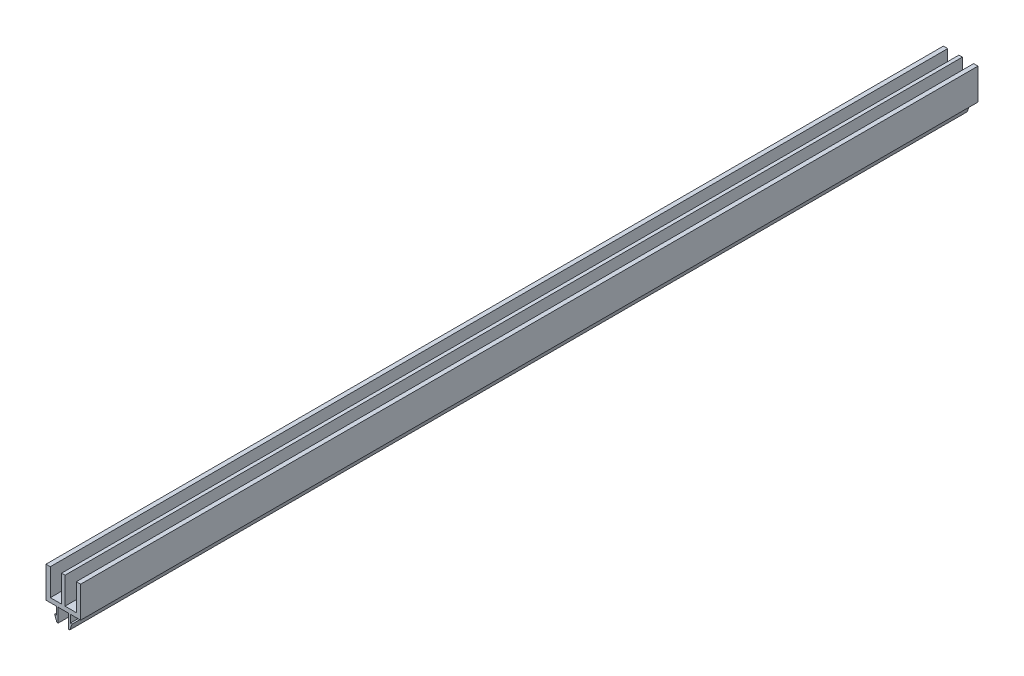
ISO-10303-21;
HEADER;
FILE_DESCRIPTION(('STEP AP214'),'2;1');
FILE_NAME('part.step','',(''),(''),'','','');
FILE_SCHEMA(('AUTOMOTIVE_DESIGN { 1 0 10303 214 1 1 1 1 }'));
ENDSEC;
DATA;
#1=APPLICATION_CONTEXT('core data for automotive mechanical design processes');
#2=APPLICATION_PROTOCOL_DEFINITION('international standard','automotive_design',2000,#1);
#3=PRODUCT_CONTEXT('',#1,'mechanical');
#4=PRODUCT('Part','Part','',(#3));
#5=PRODUCT_RELATED_PRODUCT_CATEGORY('part','',(#4));
#6=PRODUCT_DEFINITION_FORMATION('','',#4);
#7=PRODUCT_DEFINITION_CONTEXT('part definition',#1,'design');
#8=PRODUCT_DEFINITION('design','',#6,#7);
#9=PRODUCT_DEFINITION_SHAPE('','',#8);
#10=(LENGTH_UNIT() NAMED_UNIT(*) SI_UNIT(.MILLI.,.METRE.));
#11=(NAMED_UNIT(*) PLANE_ANGLE_UNIT() SI_UNIT($,.RADIAN.));
#12=(NAMED_UNIT(*) SI_UNIT($,.STERADIAN.) SOLID_ANGLE_UNIT());
#13=UNCERTAINTY_MEASURE_WITH_UNIT(LENGTH_MEASURE(1.E-05),#10,'distance_accuracy_value','');
#14=(GEOMETRIC_REPRESENTATION_CONTEXT(3) GLOBAL_UNCERTAINTY_ASSIGNED_CONTEXT((#13)) GLOBAL_UNIT_ASSIGNED_CONTEXT((#10,
#11,#12)) REPRESENTATION_CONTEXT('',''));
#15=CARTESIAN_POINT('',(0.,0.,0.));
#16=DIRECTION('',(0.,0.,1.));
#17=DIRECTION('',(1.,0.,0.));
#18=AXIS2_PLACEMENT_3D('',#15,#16,#17);
#19=CARTESIAN_POINT('',(-1.,17.9999999975,-468.));
#20=DIRECTION('',(-1.,0.,0.));
#21=DIRECTION('',(0.,-1.,0.));
#22=AXIS2_PLACEMENT_3D('',#19,#20,#21);
#23=PLANE('',#22);
#24=DIRECTION('',(0.,-1.,0.));
#25=VECTOR('',#24,1.);
#26=CARTESIAN_POINT('',(-1.,17.9999999975,50.));
#27=LINE('',#26,#25);
#28=CARTESIAN_POINT('',(-1.,17.9999999975,50.));
#29=VERTEX_POINT('',#28);
#30=CARTESIAN_POINT('',(-1.,2.4999999995,50.));
#31=VERTEX_POINT('',#30);
#32=EDGE_CURVE('E226',#29,#31,#27,.T.);
#33=ORIENTED_EDGE('',*,*,#32,.F.);
#34=DIRECTION('',(0.,0.,1.));
#35=VECTOR('',#34,1.);
#36=CARTESIAN_POINT('',(-1.,17.9999999975,-468.));
#37=LINE('',#36,#35);
#38=CARTESIAN_POINT('',(-1.,17.9999999975,-468.));
#39=VERTEX_POINT('',#38);
#40=EDGE_CURVE('E11',#39,#29,#37,.T.);
#41=ORIENTED_EDGE('',*,*,#40,.F.);
#42=DIRECTION('',(0.,-1.,0.));
#43=VECTOR('',#42,1.);
#44=CARTESIAN_POINT('',(-1.,17.9999999975,-468.));
#45=LINE('',#44,#43);
#46=CARTESIAN_POINT('',(-1.,2.4999999995,-468.));
#47=VERTEX_POINT('',#46);
#48=EDGE_CURVE('E294',#39,#47,#45,.T.);
#49=ORIENTED_EDGE('',*,*,#48,.T.);
#50=DIRECTION('',(0.,0.,1.));
#51=VECTOR('',#50,1.);
#52=CARTESIAN_POINT('',(-1.,2.4999999995,-468.));
#53=LINE('',#52,#51);
#54=EDGE_CURVE('E36',#47,#31,#53,.T.);
#55=ORIENTED_EDGE('',*,*,#54,.T.);
#56=EDGE_LOOP('',(#33,#41,#49,#55));
#57=FACE_BOUND('',#56,.T.);
#58=ADVANCED_FACE('F33',(#57),#23,.T.);
#59=CARTESIAN_POINT('',(0.999999999999998,17.9999999975,-468.));
#60=DIRECTION('',(0.,1.,0.));
#61=DIRECTION('',(0.,0.,1.));
#62=AXIS2_PLACEMENT_3D('',#59,#60,#61);
#63=PLANE('',#62);
#64=DIRECTION('',(-1.,0.,0.));
#65=VECTOR('',#64,1.);
#66=CARTESIAN_POINT('',(0.999999999999998,17.9999999975,50.));
#67=LINE('',#66,#65);
#68=CARTESIAN_POINT('',(0.999999999999998,17.9999999975,50.));
#69=VERTEX_POINT('',#68);
#70=EDGE_CURVE('E292',#69,#29,#67,.T.);
#71=ORIENTED_EDGE('',*,*,#70,.F.);
#72=DIRECTION('',(0.,0.,1.));
#73=VECTOR('',#72,1.);
#74=CARTESIAN_POINT('',(0.999999999999998,17.9999999975,-468.));
#75=LINE('',#74,#73);
#76=CARTESIAN_POINT('',(0.999999999999998,17.9999999975,-468.));
#77=VERTEX_POINT('',#76);
#78=EDGE_CURVE('E42',#77,#69,#75,.T.);
#79=ORIENTED_EDGE('',*,*,#78,.F.);
#80=DIRECTION('',(-1.,0.,0.));
#81=VECTOR('',#80,1.);
#82=CARTESIAN_POINT('',(0.999999999999998,17.9999999975,-468.));
#83=LINE('',#82,#81);
#84=EDGE_CURVE('E216',#77,#39,#83,.T.);
#85=ORIENTED_EDGE('',*,*,#84,.T.);
#86=ORIENTED_EDGE('',*,*,#40,.T.);
#87=EDGE_LOOP('',(#71,#79,#85,#86));
#88=FACE_BOUND('',#87,.T.);
#89=ADVANCED_FACE('F338',(#88),#63,.T.);
#90=CARTESIAN_POINT('',(0.999999999999998,2.4999999995,-468.));
#91=DIRECTION('',(1.,0.,0.));
#92=DIRECTION('',(0.,0.,-1.));
#93=AXIS2_PLACEMENT_3D('',#90,#91,#92);
#94=PLANE('',#93);
#95=DIRECTION('',(0.,1.,0.));
#96=VECTOR('',#95,1.);
#97=CARTESIAN_POINT('',(0.999999999999998,2.4999999995,50.));
#98=LINE('',#97,#96);
#99=CARTESIAN_POINT('',(0.999999999999998,2.4999999995,50.));
#100=VERTEX_POINT('',#99);
#101=EDGE_CURVE('E203',#100,#69,#98,.T.);
#102=ORIENTED_EDGE('',*,*,#101,.F.);
#103=DIRECTION('',(0.,0.,1.));
#104=VECTOR('',#103,1.);
#105=CARTESIAN_POINT('',(0.999999999999998,2.4999999995,-468.));
#106=LINE('',#105,#104);
#107=CARTESIAN_POINT('',(0.999999999999998,2.4999999995,-468.));
#108=VERTEX_POINT('',#107);
#109=EDGE_CURVE('E198',#108,#100,#106,.T.);
#110=ORIENTED_EDGE('',*,*,#109,.F.);
#111=DIRECTION('',(0.,1.,0.));
#112=VECTOR('',#111,1.);
#113=CARTESIAN_POINT('',(0.999999999999998,2.4999999995,-468.));
#114=LINE('',#113,#112);
#115=EDGE_CURVE('E201',#108,#77,#114,.T.);
#116=ORIENTED_EDGE('',*,*,#115,.T.);
#117=ORIENTED_EDGE('',*,*,#78,.T.);
#118=EDGE_LOOP('',(#102,#110,#116,#117));
#119=FACE_BOUND('',#118,.T.);
#120=ADVANCED_FACE('F200',(#119),#94,.T.);
#121=CARTESIAN_POINT('',(7.5,2.4999999995,-468.));
#122=DIRECTION('',(0.,1.,0.));
#123=DIRECTION('',(-1.,0.,0.));
#124=AXIS2_PLACEMENT_3D('',#121,#122,#123);
#125=PLANE('',#124);
#126=DIRECTION('',(-1.,0.,0.));
#127=VECTOR('',#126,1.);
#128=CARTESIAN_POINT('',(7.5,2.4999999995,50.));
#129=LINE('',#128,#127);
#130=CARTESIAN_POINT('',(7.5,2.4999999995,50.));
#131=VERTEX_POINT('',#130);
#132=EDGE_CURVE('E289',#131,#100,#129,.T.);
#133=ORIENTED_EDGE('',*,*,#132,.F.);
#134=DIRECTION('',(0.,0.,1.));
#135=VECTOR('',#134,1.);
#136=CARTESIAN_POINT('',(7.5,2.4999999995,-468.));
#137=LINE('',#136,#135);
#138=CARTESIAN_POINT('',(7.5,2.4999999995,-468.));
#139=VERTEX_POINT('',#138);
#140=EDGE_CURVE('E208',#139,#131,#137,.T.);
#141=ORIENTED_EDGE('',*,*,#140,.F.);
#142=DIRECTION('',(-1.,0.,0.));
#143=VECTOR('',#142,1.);
#144=CARTESIAN_POINT('',(7.5,2.4999999995,-468.));
#145=LINE('',#144,#143);
#146=EDGE_CURVE('E214',#139,#108,#145,.T.);
#147=ORIENTED_EDGE('',*,*,#146,.T.);
#148=ORIENTED_EDGE('',*,*,#109,.T.);
#149=EDGE_LOOP('',(#133,#141,#147,#148));
#150=FACE_BOUND('',#149,.T.);
#151=ADVANCED_FACE('F218',(#150),#125,.T.);
#152=CARTESIAN_POINT('',(7.5,17.9999999975,-468.));
#153=DIRECTION('',(-1.,0.,0.));
#154=DIRECTION('',(0.,-1.,0.));
#155=AXIS2_PLACEMENT_3D('',#152,#153,#154);
#156=PLANE('',#155);
#157=DIRECTION('',(0.,-1.,0.));
#158=VECTOR('',#157,1.);
#159=CARTESIAN_POINT('',(7.5,17.9999999975,50.));
#160=LINE('',#159,#158);
#161=CARTESIAN_POINT('',(7.5,17.9999999975,50.));
#162=VERTEX_POINT('',#161);
#163=EDGE_CURVE('E286',#162,#131,#160,.T.);
#164=ORIENTED_EDGE('',*,*,#163,.F.);
#165=DIRECTION('',(0.,0.,1.));
#166=VECTOR('',#165,1.);
#167=CARTESIAN_POINT('',(7.5,17.9999999975,-468.));
#168=LINE('',#167,#166);
#169=CARTESIAN_POINT('',(7.5,17.9999999975,-468.));
#170=VERTEX_POINT('',#169);
#171=EDGE_CURVE('E298',#170,#162,#168,.T.);
#172=ORIENTED_EDGE('',*,*,#171,.F.);
#173=DIRECTION('',(0.,-1.,0.));
#174=VECTOR('',#173,1.);
#175=CARTESIAN_POINT('',(7.5,17.9999999975,-468.));
#176=LINE('',#175,#174);
#177=EDGE_CURVE('E219',#170,#139,#176,.T.);
#178=ORIENTED_EDGE('',*,*,#177,.T.);
#179=ORIENTED_EDGE('',*,*,#140,.T.);
#180=EDGE_LOOP('',(#164,#172,#178,#179));
#181=FACE_BOUND('',#180,.T.);
#182=ADVANCED_FACE('F351',(#181),#156,.T.);
#183=CARTESIAN_POINT('',(10.,17.9999999975,-468.));
#184=DIRECTION('',(0.,1.,0.));
#185=DIRECTION('',(0.,0.,1.));
#186=AXIS2_PLACEMENT_3D('',#183,#184,#185);
#187=PLANE('',#186);
#188=DIRECTION('',(-1.,0.,0.));
#189=VECTOR('',#188,1.);
#190=CARTESIAN_POINT('',(10.,17.9999999975,50.));
#191=LINE('',#190,#189);
#192=CARTESIAN_POINT('',(10.,17.9999999975,50.));
#193=VERTEX_POINT('',#192);
#194=EDGE_CURVE('E283',#193,#162,#191,.T.);
#195=ORIENTED_EDGE('',*,*,#194,.F.);
#196=DIRECTION('',(0.,0.,1.));
#197=VECTOR('',#196,1.);
#198=CARTESIAN_POINT('',(10.,17.9999999975,-468.));
#199=LINE('',#198,#197);
#200=CARTESIAN_POINT('',(10.,17.9999999975,-468.));
#201=VERTEX_POINT('',#200);
#202=EDGE_CURVE('E300',#201,#193,#199,.T.);
#203=ORIENTED_EDGE('',*,*,#202,.F.);
#204=DIRECTION('',(-1.,0.,0.));
#205=VECTOR('',#204,1.);
#206=CARTESIAN_POINT('',(10.,17.9999999975,-468.));
#207=LINE('',#206,#205);
#208=EDGE_CURVE('E221',#201,#170,#207,.T.);
#209=ORIENTED_EDGE('',*,*,#208,.T.);
#210=ORIENTED_EDGE('',*,*,#171,.T.);
#211=EDGE_LOOP('',(#195,#203,#209,#210));
#212=FACE_BOUND('',#211,.T.);
#213=ADVANCED_FACE('F354',(#212),#187,.T.);
#214=CARTESIAN_POINT('',(10.,-4.99999828349541E-10,-468.));
#215=DIRECTION('',(1.,0.,0.));
#216=DIRECTION('',(0.,0.,-1.));
#217=AXIS2_PLACEMENT_3D('',#214,#215,#216);
#218=PLANE('',#217);
#219=DIRECTION('',(0.,1.,0.));
#220=VECTOR('',#219,1.);
#221=CARTESIAN_POINT('',(10.,-4.99999828349541E-10,50.));
#222=LINE('',#221,#220);
#223=CARTESIAN_POINT('',(10.,-4.99999828349541E-10,50.));
#224=VERTEX_POINT('',#223);
#225=EDGE_CURVE('E280',#224,#193,#222,.T.);
#226=ORIENTED_EDGE('',*,*,#225,.F.);
#227=DIRECTION('',(0.,0.,1.));
#228=VECTOR('',#227,1.);
#229=CARTESIAN_POINT('',(10.,-4.99999828349541E-10,-468.));
#230=LINE('',#229,#228);
#231=CARTESIAN_POINT('',(10.,-4.99999828349541E-10,-468.));
#232=VERTEX_POINT('',#231);
#233=EDGE_CURVE('E302',#232,#224,#230,.T.);
#234=ORIENTED_EDGE('',*,*,#233,.F.);
#235=DIRECTION('',(0.,1.,0.));
#236=VECTOR('',#235,1.);
#237=CARTESIAN_POINT('',(10.,-4.99999828349541E-10,-468.));
#238=LINE('',#237,#236);
#239=EDGE_CURVE('E644',#232,#201,#238,.T.);
#240=ORIENTED_EDGE('',*,*,#239,.T.);
#241=ORIENTED_EDGE('',*,*,#202,.T.);
#242=EDGE_LOOP('',(#226,#234,#240,#241));
#243=FACE_BOUND('',#242,.T.);
#244=ADVANCED_FACE('F358',(#243),#218,.T.);
#245=CARTESIAN_POINT('',(4.,-4.99999998002099E-10,-468.));
#246=DIRECTION('',(0.,-1.,0.));
#247=DIRECTION('',(1.,0.,0.));
#248=AXIS2_PLACEMENT_3D('',#245,#246,#247);
#249=PLANE('',#248);
#250=DIRECTION('',(1.,0.,0.));
#251=VECTOR('',#250,1.);
#252=CARTESIAN_POINT('',(4.,-4.99999998002099E-10,50.));
#253=LINE('',#252,#251);
#254=CARTESIAN_POINT('',(4.,-4.99999998002099E-10,50.));
#255=VERTEX_POINT('',#254);
#256=EDGE_CURVE('E277',#255,#224,#253,.T.);
#257=ORIENTED_EDGE('',*,*,#256,.F.);
#258=DIRECTION('',(0.,0.,1.));
#259=VECTOR('',#258,1.);
#260=CARTESIAN_POINT('',(4.,-4.99999998002099E-10,-468.));
#261=LINE('',#260,#259);
#262=CARTESIAN_POINT('',(4.,-4.99999998002099E-10,-468.));
#263=VERTEX_POINT('',#262);
#264=EDGE_CURVE('E304',#263,#255,#261,.T.);
#265=ORIENTED_EDGE('',*,*,#264,.F.);
#266=DIRECTION('',(1.,0.,0.));
#267=VECTOR('',#266,1.);
#268=CARTESIAN_POINT('',(4.,-4.99999998002099E-10,-468.));
#269=LINE('',#268,#267);
#270=EDGE_CURVE('E648',#263,#232,#269,.T.);
#271=ORIENTED_EDGE('',*,*,#270,.T.);
#272=ORIENTED_EDGE('',*,*,#233,.T.);
#273=EDGE_LOOP('',(#257,#265,#271,#272));
#274=FACE_BOUND('',#273,.T.);
#275=ADVANCED_FACE('F362',(#274),#249,.T.);
#276=CARTESIAN_POINT('',(4.,-4.5,-468.));
#277=DIRECTION('',(1.,0.,0.));
#278=DIRECTION('',(0.,0.,-1.));
#279=AXIS2_PLACEMENT_3D('',#276,#277,#278);
#280=PLANE('',#279);
#281=DIRECTION('',(0.,1.,0.));
#282=VECTOR('',#281,1.);
#283=CARTESIAN_POINT('',(4.,-4.5,50.));
#284=LINE('',#283,#282);
#285=CARTESIAN_POINT('',(4.,-4.5,50.));
#286=VERTEX_POINT('',#285);
#287=EDGE_CURVE('E274',#286,#255,#284,.T.);
#288=ORIENTED_EDGE('',*,*,#287,.F.);
#289=DIRECTION('',(0.,0.,1.));
#290=VECTOR('',#289,1.);
#291=CARTESIAN_POINT('',(4.,-4.5,-468.));
#292=LINE('',#291,#290);
#293=CARTESIAN_POINT('',(4.,-4.5,-468.));
#294=VERTEX_POINT('',#293);
#295=EDGE_CURVE('E306',#294,#286,#292,.T.);
#296=ORIENTED_EDGE('',*,*,#295,.F.);
#297=DIRECTION('',(0.,1.,0.));
#298=VECTOR('',#297,1.);
#299=CARTESIAN_POINT('',(4.,-4.5,-468.));
#300=LINE('',#299,#298);
#301=EDGE_CURVE('E637',#294,#263,#300,.T.);
#302=ORIENTED_EDGE('',*,*,#301,.T.);
#303=ORIENTED_EDGE('',*,*,#264,.T.);
#304=EDGE_LOOP('',(#288,#296,#302,#303));
#305=FACE_BOUND('',#304,.T.);
#306=ADVANCED_FACE('F366',(#305),#280,.T.);
#307=CARTESIAN_POINT('',(5.,-4.5,-468.));
#308=DIRECTION('',(0.,1.,0.));
#309=DIRECTION('',(0.,0.,1.));
#310=AXIS2_PLACEMENT_3D('',#307,#308,#309);
#311=PLANE('',#310);
#312=DIRECTION('',(-1.,0.,0.));
#313=VECTOR('',#312,1.);
#314=CARTESIAN_POINT('',(5.,-4.5,50.));
#315=LINE('',#314,#313);
#316=CARTESIAN_POINT('',(5.,-4.5,50.));
#317=VERTEX_POINT('',#316);
#318=EDGE_CURVE('E271',#317,#286,#315,.T.);
#319=ORIENTED_EDGE('',*,*,#318,.F.);
#320=DIRECTION('',(0.,0.,1.));
#321=VECTOR('',#320,1.);
#322=CARTESIAN_POINT('',(5.,-4.5,-468.));
#323=LINE('',#322,#321);
#324=CARTESIAN_POINT('',(5.,-4.5,-468.));
#325=VERTEX_POINT('',#324);
#326=EDGE_CURVE('E308',#325,#317,#323,.T.);
#327=ORIENTED_EDGE('',*,*,#326,.F.);
#328=DIRECTION('',(-1.,0.,0.));
#329=VECTOR('',#328,1.);
#330=CARTESIAN_POINT('',(5.,-4.5,-468.));
#331=LINE('',#330,#329);
#332=EDGE_CURVE('E633',#325,#294,#331,.T.);
#333=ORIENTED_EDGE('',*,*,#332,.T.);
#334=ORIENTED_EDGE('',*,*,#295,.T.);
#335=EDGE_LOOP('',(#319,#327,#333,#334));
#336=FACE_BOUND('',#335,.T.);
#337=ADVANCED_FACE('F370',(#336),#311,.T.);
#338=CARTESIAN_POINT('',(3.75,-8.,-468.));
#339=DIRECTION('',(0.941741911594837,-0.336336396998157,0.));
#340=DIRECTION('',(0.336336396998157,0.941741911594837,0.));
#341=AXIS2_PLACEMENT_3D('',#338,#339,#340);
#342=PLANE('',#341);
#343=DIRECTION('',(0.336336396998157,0.941741911594837,0.));
#344=VECTOR('',#343,1.);
#345=CARTESIAN_POINT('',(3.75,-8.,50.));
#346=LINE('',#345,#344);
#347=CARTESIAN_POINT('',(3.75,-8.,50.));
#348=VERTEX_POINT('',#347);
#349=EDGE_CURVE('E268',#348,#317,#346,.T.);
#350=ORIENTED_EDGE('',*,*,#349,.F.);
#351=DIRECTION('',(0.,0.,1.));
#352=VECTOR('',#351,1.);
#353=CARTESIAN_POINT('',(3.75,-8.,-468.));
#354=LINE('',#353,#352);
#355=CARTESIAN_POINT('',(3.75,-8.,-468.));
#356=VERTEX_POINT('',#355);
#357=EDGE_CURVE('E310',#356,#348,#354,.T.);
#358=ORIENTED_EDGE('',*,*,#357,.F.);
#359=DIRECTION('',(0.336336396998157,0.941741911594837,0.));
#360=VECTOR('',#359,1.);
#361=CARTESIAN_POINT('',(3.75,-8.,-468.));
#362=LINE('',#361,#360);
#363=EDGE_CURVE('E654',#356,#325,#362,.T.);
#364=ORIENTED_EDGE('',*,*,#363,.T.);
#365=ORIENTED_EDGE('',*,*,#326,.T.);
#366=EDGE_LOOP('',(#350,#358,#364,#365));
#367=FACE_BOUND('',#366,.T.);
#368=ADVANCED_FACE('F374',(#367),#342,.T.);
#369=CARTESIAN_POINT('',(3.,-8.,-468.));
#370=DIRECTION('',(0.,-1.,0.));
#371=DIRECTION('',(0.,0.,-1.));
#372=AXIS2_PLACEMENT_3D('',#369,#370,#371);
#373=PLANE('',#372);
#374=DIRECTION('',(1.,0.,0.));
#375=VECTOR('',#374,1.);
#376=CARTESIAN_POINT('',(3.,-8.,50.));
#377=LINE('',#376,#375);
#378=CARTESIAN_POINT('',(3.,-8.,50.));
#379=VERTEX_POINT('',#378);
#380=EDGE_CURVE('E265',#379,#348,#377,.T.);
#381=ORIENTED_EDGE('',*,*,#380,.F.);
#382=DIRECTION('',(0.,0.,1.));
#383=VECTOR('',#382,1.);
#384=CARTESIAN_POINT('',(3.,-8.,-468.));
#385=LINE('',#384,#383);
#386=CARTESIAN_POINT('',(3.,-8.,-468.));
#387=VERTEX_POINT('',#386);
#388=EDGE_CURVE('E312',#387,#379,#385,.T.);
#389=ORIENTED_EDGE('',*,*,#388,.F.);
#390=DIRECTION('',(1.,0.,0.));
#391=VECTOR('',#390,1.);
#392=CARTESIAN_POINT('',(3.,-8.,-468.));
#393=LINE('',#392,#391);
#394=EDGE_CURVE('E626',#387,#356,#393,.T.);
#395=ORIENTED_EDGE('',*,*,#394,.T.);
#396=ORIENTED_EDGE('',*,*,#357,.T.);
#397=EDGE_LOOP('',(#381,#389,#395,#396));
#398=FACE_BOUND('',#397,.T.);
#399=ADVANCED_FACE('F378',(#398),#373,.T.);
#400=CARTESIAN_POINT('',(3.,-4.9999985194348E-10,-468.));
#401=DIRECTION('',(-1.,0.,0.));
#402=DIRECTION('',(0.,0.,1.));
#403=AXIS2_PLACEMENT_3D('',#400,#401,#402);
#404=PLANE('',#403);
#405=DIRECTION('',(0.,-1.,0.));
#406=VECTOR('',#405,1.);
#407=CARTESIAN_POINT('',(3.,-4.9999985194348E-10,50.));
#408=LINE('',#407,#406);
#409=CARTESIAN_POINT('',(3.,-4.9999985194348E-10,50.));
#410=VERTEX_POINT('',#409);
#411=EDGE_CURVE('E262',#410,#379,#408,.T.);
#412=ORIENTED_EDGE('',*,*,#411,.F.);
#413=DIRECTION('',(0.,0.,1.));
#414=VECTOR('',#413,1.);
#415=CARTESIAN_POINT('',(3.,-4.9999985194348E-10,-468.));
#416=LINE('',#415,#414);
#417=CARTESIAN_POINT('',(3.,-4.9999985194348E-10,-468.));
#418=VERTEX_POINT('',#417);
#419=EDGE_CURVE('E314',#418,#410,#416,.T.);
#420=ORIENTED_EDGE('',*,*,#419,.F.);
#421=DIRECTION('',(0.,-1.,0.));
#422=VECTOR('',#421,1.);
#423=CARTESIAN_POINT('',(3.,-4.9999985194348E-10,-468.));
#424=LINE('',#423,#422);
#425=EDGE_CURVE('E622',#418,#387,#424,.T.);
#426=ORIENTED_EDGE('',*,*,#425,.T.);
#427=ORIENTED_EDGE('',*,*,#388,.T.);
#428=EDGE_LOOP('',(#412,#420,#426,#427));
#429=FACE_BOUND('',#428,.T.);
#430=ADVANCED_FACE('F382',(#429),#404,.T.);
#431=CARTESIAN_POINT('',(-3.,-4.99999455901012E-10,-468.));
#432=DIRECTION('',(0.,-1.,0.));
#433=DIRECTION('',(1.,0.,0.));
#434=AXIS2_PLACEMENT_3D('',#431,#432,#433);
#435=PLANE('',#434);
#436=DIRECTION('',(1.,0.,0.));
#437=VECTOR('',#436,1.);
#438=CARTESIAN_POINT('',(-3.,-4.99999455901012E-10,50.));
#439=LINE('',#438,#437);
#440=CARTESIAN_POINT('',(-3.,-4.99999455901012E-10,50.));
#441=VERTEX_POINT('',#440);
#442=EDGE_CURVE('E259',#441,#410,#439,.T.);
#443=ORIENTED_EDGE('',*,*,#442,.F.);
#444=DIRECTION('',(0.,0.,1.));
#445=VECTOR('',#444,1.);
#446=CARTESIAN_POINT('',(-3.,-4.99999455901012E-10,-468.));
#447=LINE('',#446,#445);
#448=CARTESIAN_POINT('',(-3.,-4.99999455901012E-10,-468.));
#449=VERTEX_POINT('',#448);
#450=EDGE_CURVE('E316',#449,#441,#447,.T.);
#451=ORIENTED_EDGE('',*,*,#450,.F.);
#452=DIRECTION('',(1.,0.,0.));
#453=VECTOR('',#452,1.);
#454=CARTESIAN_POINT('',(-3.,-4.99999455901012E-10,-468.));
#455=LINE('',#454,#453);
#456=EDGE_CURVE('E658',#449,#418,#455,.T.);
#457=ORIENTED_EDGE('',*,*,#456,.T.);
#458=ORIENTED_EDGE('',*,*,#419,.T.);
#459=EDGE_LOOP('',(#443,#451,#457,#458));
#460=FACE_BOUND('',#459,.T.);
#461=ADVANCED_FACE('F386',(#460),#435,.T.);
#462=CARTESIAN_POINT('',(-3.,-8.,-468.));
#463=DIRECTION('',(1.,0.,0.));
#464=DIRECTION('',(0.,0.,-1.));
#465=AXIS2_PLACEMENT_3D('',#462,#463,#464);
#466=PLANE('',#465);
#467=DIRECTION('',(0.,1.,0.));
#468=VECTOR('',#467,1.);
#469=CARTESIAN_POINT('',(-3.,-8.,50.));
#470=LINE('',#469,#468);
#471=CARTESIAN_POINT('',(-3.,-8.,50.));
#472=VERTEX_POINT('',#471);
#473=EDGE_CURVE('E256',#472,#441,#470,.T.);
#474=ORIENTED_EDGE('',*,*,#473,.F.);
#475=DIRECTION('',(0.,0.,1.));
#476=VECTOR('',#475,1.);
#477=CARTESIAN_POINT('',(-3.,-8.,-468.));
#478=LINE('',#477,#476);
#479=CARTESIAN_POINT('',(-3.,-8.,-468.));
#480=VERTEX_POINT('',#479);
#481=EDGE_CURVE('E318',#480,#472,#478,.T.);
#482=ORIENTED_EDGE('',*,*,#481,.F.);
#483=DIRECTION('',(0.,1.,0.));
#484=VECTOR('',#483,1.);
#485=CARTESIAN_POINT('',(-3.,-8.,-468.));
#486=LINE('',#485,#484);
#487=EDGE_CURVE('E615',#480,#449,#486,.T.);
#488=ORIENTED_EDGE('',*,*,#487,.T.);
#489=ORIENTED_EDGE('',*,*,#450,.T.);
#490=EDGE_LOOP('',(#474,#482,#488,#489));
#491=FACE_BOUND('',#490,.T.);
#492=ADVANCED_FACE('F390',(#491),#466,.T.);
#493=CARTESIAN_POINT('',(-3.75,-8.,-468.));
#494=DIRECTION('',(0.,-1.,0.));
#495=DIRECTION('',(0.,0.,-1.));
#496=AXIS2_PLACEMENT_3D('',#493,#494,#495);
#497=PLANE('',#496);
#498=DIRECTION('',(1.,0.,0.));
#499=VECTOR('',#498,1.);
#500=CARTESIAN_POINT('',(-3.75,-8.,50.));
#501=LINE('',#500,#499);
#502=CARTESIAN_POINT('',(-3.75,-8.,50.));
#503=VERTEX_POINT('',#502);
#504=EDGE_CURVE('E253',#503,#472,#501,.T.);
#505=ORIENTED_EDGE('',*,*,#504,.F.);
#506=DIRECTION('',(0.,0.,1.));
#507=VECTOR('',#506,1.);
#508=CARTESIAN_POINT('',(-3.75,-8.,-468.));
#509=LINE('',#508,#507);
#510=CARTESIAN_POINT('',(-3.75,-8.,-468.));
#511=VERTEX_POINT('',#510);
#512=EDGE_CURVE('E320',#511,#503,#509,.T.);
#513=ORIENTED_EDGE('',*,*,#512,.F.);
#514=DIRECTION('',(1.,0.,0.));
#515=VECTOR('',#514,1.);
#516=CARTESIAN_POINT('',(-3.75,-8.,-468.));
#517=LINE('',#516,#515);
#518=EDGE_CURVE('E611',#511,#480,#517,.T.);
#519=ORIENTED_EDGE('',*,*,#518,.T.);
#520=ORIENTED_EDGE('',*,*,#481,.T.);
#521=EDGE_LOOP('',(#505,#513,#519,#520));
#522=FACE_BOUND('',#521,.T.);
#523=ADVANCED_FACE('F394',(#522),#497,.T.);
#524=CARTESIAN_POINT('',(-5.,-4.5,-468.));
#525=DIRECTION('',(-0.941741911594837,-0.336336396998156,0.));
#526=DIRECTION('',(0.336336396998156,-0.941741911594838,0.));
#527=AXIS2_PLACEMENT_3D('',#524,#525,#526);
#528=PLANE('',#527);
#529=DIRECTION('',(0.336336396998156,-0.941741911594837,0.));
#530=VECTOR('',#529,1.);
#531=CARTESIAN_POINT('',(-5.,-4.5,50.));
#532=LINE('',#531,#530);
#533=CARTESIAN_POINT('',(-5.,-4.5,50.));
#534=VERTEX_POINT('',#533);
#535=EDGE_CURVE('E250',#534,#503,#532,.T.);
#536=ORIENTED_EDGE('',*,*,#535,.F.);
#537=DIRECTION('',(0.,0.,1.));
#538=VECTOR('',#537,1.);
#539=CARTESIAN_POINT('',(-5.,-4.5,-468.));
#540=LINE('',#539,#538);
#541=CARTESIAN_POINT('',(-5.,-4.5,-468.));
#542=VERTEX_POINT('',#541);
#543=EDGE_CURVE('E322',#542,#534,#540,.T.);
#544=ORIENTED_EDGE('',*,*,#543,.F.);
#545=DIRECTION('',(0.336336396998156,-0.941741911594837,0.));
#546=VECTOR('',#545,1.);
#547=CARTESIAN_POINT('',(-5.,-4.5,-468.));
#548=LINE('',#547,#546);
#549=EDGE_CURVE('E662',#542,#511,#548,.T.);
#550=ORIENTED_EDGE('',*,*,#549,.T.);
#551=ORIENTED_EDGE('',*,*,#512,.T.);
#552=EDGE_LOOP('',(#536,#544,#550,#551));
#553=FACE_BOUND('',#552,.T.);
#554=ADVANCED_FACE('F398',(#553),#528,.T.);
#555=CARTESIAN_POINT('',(-4.,-4.5,-468.));
#556=DIRECTION('',(0.,1.,0.));
#557=DIRECTION('',(0.,0.,1.));
#558=AXIS2_PLACEMENT_3D('',#555,#556,#557);
#559=PLANE('',#558);
#560=DIRECTION('',(-1.,0.,0.));
#561=VECTOR('',#560,1.);
#562=CARTESIAN_POINT('',(-4.,-4.5,50.));
#563=LINE('',#562,#561);
#564=CARTESIAN_POINT('',(-4.,-4.5,50.));
#565=VERTEX_POINT('',#564);
#566=EDGE_CURVE('E247',#565,#534,#563,.T.);
#567=ORIENTED_EDGE('',*,*,#566,.F.);
#568=DIRECTION('',(0.,0.,1.));
#569=VECTOR('',#568,1.);
#570=CARTESIAN_POINT('',(-4.,-4.5,-468.));
#571=LINE('',#570,#569);
#572=CARTESIAN_POINT('',(-4.,-4.5,-468.));
#573=VERTEX_POINT('',#572);
#574=EDGE_CURVE('E324',#573,#565,#571,.T.);
#575=ORIENTED_EDGE('',*,*,#574,.F.);
#576=DIRECTION('',(-1.,0.,0.));
#577=VECTOR('',#576,1.);
#578=CARTESIAN_POINT('',(-4.,-4.5,-468.));
#579=LINE('',#578,#577);
#580=EDGE_CURVE('E604',#573,#542,#579,.T.);
#581=ORIENTED_EDGE('',*,*,#580,.T.);
#582=ORIENTED_EDGE('',*,*,#543,.T.);
#583=EDGE_LOOP('',(#567,#575,#581,#582));
#584=FACE_BOUND('',#583,.T.);
#585=ADVANCED_FACE('F402',(#584),#559,.T.);
#586=CARTESIAN_POINT('',(-4.,-4.9999985194348E-10,-468.));
#587=DIRECTION('',(-1.,0.,0.));
#588=DIRECTION('',(0.,0.,1.));
#589=AXIS2_PLACEMENT_3D('',#586,#587,#588);
#590=PLANE('',#589);
#591=DIRECTION('',(0.,-1.,0.));
#592=VECTOR('',#591,1.);
#593=CARTESIAN_POINT('',(-4.,-4.9999985194348E-10,50.));
#594=LINE('',#593,#592);
#595=CARTESIAN_POINT('',(-4.,-4.9999985194348E-10,50.));
#596=VERTEX_POINT('',#595);
#597=EDGE_CURVE('E244',#596,#565,#594,.T.);
#598=ORIENTED_EDGE('',*,*,#597,.F.);
#599=DIRECTION('',(0.,0.,1.));
#600=VECTOR('',#599,1.);
#601=CARTESIAN_POINT('',(-4.,-4.9999985194348E-10,-468.));
#602=LINE('',#601,#600);
#603=CARTESIAN_POINT('',(-4.,-4.9999985194348E-10,-468.));
#604=VERTEX_POINT('',#603);
#605=EDGE_CURVE('E326',#604,#596,#602,.T.);
#606=ORIENTED_EDGE('',*,*,#605,.F.);
#607=DIRECTION('',(0.,-1.,0.));
#608=VECTOR('',#607,1.);
#609=CARTESIAN_POINT('',(-4.,-4.9999985194348E-10,-468.));
#610=LINE('',#609,#608);
#611=EDGE_CURVE('E600',#604,#573,#610,.T.);
#612=ORIENTED_EDGE('',*,*,#611,.T.);
#613=ORIENTED_EDGE('',*,*,#574,.T.);
#614=EDGE_LOOP('',(#598,#606,#612,#613));
#615=FACE_BOUND('',#614,.T.);
#616=ADVANCED_FACE('F406',(#615),#590,.T.);
#617=CARTESIAN_POINT('',(-10.,-4.99999719929324E-10,-468.));
#618=DIRECTION('',(0.,-1.,0.));
#619=DIRECTION('',(1.,0.,0.));
#620=AXIS2_PLACEMENT_3D('',#617,#618,#619);
#621=PLANE('',#620);
#622=DIRECTION('',(1.,0.,0.));
#623=VECTOR('',#622,1.);
#624=CARTESIAN_POINT('',(-10.,-4.99999719929324E-10,50.));
#625=LINE('',#624,#623);
#626=CARTESIAN_POINT('',(-10.,-4.99999719929324E-10,50.));
#627=VERTEX_POINT('',#626);
#628=EDGE_CURVE('E241',#627,#596,#625,.T.);
#629=ORIENTED_EDGE('',*,*,#628,.F.);
#630=DIRECTION('',(0.,0.,1.));
#631=VECTOR('',#630,1.);
#632=CARTESIAN_POINT('',(-10.,-4.99999719929324E-10,-468.));
#633=LINE('',#632,#631);
#634=CARTESIAN_POINT('',(-10.,-4.99999719929324E-10,-468.));
#635=VERTEX_POINT('',#634);
#636=EDGE_CURVE('E328',#635,#627,#633,.T.);
#637=ORIENTED_EDGE('',*,*,#636,.F.);
#638=DIRECTION('',(1.,0.,0.));
#639=VECTOR('',#638,1.);
#640=CARTESIAN_POINT('',(-10.,-4.99999719929324E-10,-468.));
#641=LINE('',#640,#639);
#642=EDGE_CURVE('E666',#635,#604,#641,.T.);
#643=ORIENTED_EDGE('',*,*,#642,.T.);
#644=ORIENTED_EDGE('',*,*,#605,.T.);
#645=EDGE_LOOP('',(#629,#637,#643,#644));
#646=FACE_BOUND('',#645,.T.);
#647=ADVANCED_FACE('F410',(#646),#621,.T.);
#648=CARTESIAN_POINT('',(-10.,17.9999999975,-468.));
#649=DIRECTION('',(-1.,0.,0.));
#650=DIRECTION('',(0.,-1.,0.));
#651=AXIS2_PLACEMENT_3D('',#648,#649,#650);
#652=PLANE('',#651);
#653=DIRECTION('',(0.,-1.,0.));
#654=VECTOR('',#653,1.);
#655=CARTESIAN_POINT('',(-10.,17.9999999975,50.));
#656=LINE('',#655,#654);
#657=CARTESIAN_POINT('',(-10.,17.9999999975,50.));
#658=VERTEX_POINT('',#657);
#659=EDGE_CURVE('E238',#658,#627,#656,.T.);
#660=ORIENTED_EDGE('',*,*,#659,.F.);
#661=DIRECTION('',(0.,0.,1.));
#662=VECTOR('',#661,1.);
#663=CARTESIAN_POINT('',(-10.,17.9999999975,-468.));
#664=LINE('',#663,#662);
#665=CARTESIAN_POINT('',(-10.,17.9999999975,-468.));
#666=VERTEX_POINT('',#665);
#667=EDGE_CURVE('E330',#666,#658,#664,.T.);
#668=ORIENTED_EDGE('',*,*,#667,.F.);
#669=DIRECTION('',(0.,-1.,0.));
#670=VECTOR('',#669,1.);
#671=CARTESIAN_POINT('',(-10.,17.9999999975,-468.));
#672=LINE('',#671,#670);
#673=EDGE_CURVE('E593',#666,#635,#672,.T.);
#674=ORIENTED_EDGE('',*,*,#673,.T.);
#675=ORIENTED_EDGE('',*,*,#636,.T.);
#676=EDGE_LOOP('',(#660,#668,#674,#675));
#677=FACE_BOUND('',#676,.T.);
#678=ADVANCED_FACE('F414',(#677),#652,.T.);
#679=CARTESIAN_POINT('',(-7.5,17.9999999975,-468.));
#680=DIRECTION('',(0.,1.,0.));
#681=DIRECTION('',(0.,0.,1.));
#682=AXIS2_PLACEMENT_3D('',#679,#680,#681);
#683=PLANE('',#682);
#684=DIRECTION('',(-1.,0.,0.));
#685=VECTOR('',#684,1.);
#686=CARTESIAN_POINT('',(-7.5,17.9999999975,50.));
#687=LINE('',#686,#685);
#688=CARTESIAN_POINT('',(-7.5,17.9999999975,50.));
#689=VERTEX_POINT('',#688);
#690=EDGE_CURVE('E235',#689,#658,#687,.T.);
#691=ORIENTED_EDGE('',*,*,#690,.F.);
#692=DIRECTION('',(0.,0.,1.));
#693=VECTOR('',#692,1.);
#694=CARTESIAN_POINT('',(-7.5,17.9999999975,-468.));
#695=LINE('',#694,#693);
#696=CARTESIAN_POINT('',(-7.5,17.9999999975,-468.));
#697=VERTEX_POINT('',#696);
#698=EDGE_CURVE('E332',#697,#689,#695,.T.);
#699=ORIENTED_EDGE('',*,*,#698,.F.);
#700=DIRECTION('',(-1.,0.,0.));
#701=VECTOR('',#700,1.);
#702=CARTESIAN_POINT('',(-7.5,17.9999999975,-468.));
#703=LINE('',#702,#701);
#704=EDGE_CURVE('E589',#697,#666,#703,.T.);
#705=ORIENTED_EDGE('',*,*,#704,.T.);
#706=ORIENTED_EDGE('',*,*,#667,.T.);
#707=EDGE_LOOP('',(#691,#699,#705,#706));
#708=FACE_BOUND('',#707,.T.);
#709=ADVANCED_FACE('F418',(#708),#683,.T.);
#710=CARTESIAN_POINT('',(-7.5,2.4999999995,-468.));
#711=DIRECTION('',(1.,0.,0.));
#712=DIRECTION('',(0.,0.,-1.));
#713=AXIS2_PLACEMENT_3D('',#710,#711,#712);
#714=PLANE('',#713);
#715=DIRECTION('',(0.,1.,0.));
#716=VECTOR('',#715,1.);
#717=CARTESIAN_POINT('',(-7.5,2.4999999995,50.));
#718=LINE('',#717,#716);
#719=CARTESIAN_POINT('',(-7.5,2.4999999995,50.));
#720=VERTEX_POINT('',#719);
#721=EDGE_CURVE('E232',#720,#689,#718,.T.);
#722=ORIENTED_EDGE('',*,*,#721,.F.);
#723=DIRECTION('',(0.,0.,1.));
#724=VECTOR('',#723,1.);
#725=CARTESIAN_POINT('',(-7.5,2.4999999995,-468.));
#726=LINE('',#725,#724);
#727=CARTESIAN_POINT('',(-7.5,2.4999999995,-468.));
#728=VERTEX_POINT('',#727);
#729=EDGE_CURVE('E333',#728,#720,#726,.T.);
#730=ORIENTED_EDGE('',*,*,#729,.F.);
#731=DIRECTION('',(0.,1.,0.));
#732=VECTOR('',#731,1.);
#733=CARTESIAN_POINT('',(-7.5,2.4999999995,-468.));
#734=LINE('',#733,#732);
#735=EDGE_CURVE('E670',#728,#697,#734,.T.);
#736=ORIENTED_EDGE('',*,*,#735,.T.);
#737=ORIENTED_EDGE('',*,*,#698,.T.);
#738=EDGE_LOOP('',(#722,#730,#736,#737));
#739=FACE_BOUND('',#738,.T.);
#740=ADVANCED_FACE('F422',(#739),#714,.T.);
#741=CARTESIAN_POINT('',(-1.,2.4999999995,-468.));
#742=DIRECTION('',(0.,1.,0.));
#743=DIRECTION('',(-1.,0.,0.));
#744=AXIS2_PLACEMENT_3D('',#741,#742,#743);
#745=PLANE('',#744);
#746=DIRECTION('',(-1.,0.,0.));
#747=VECTOR('',#746,1.);
#748=CARTESIAN_POINT('',(-1.,2.4999999995,50.));
#749=LINE('',#748,#747);
#750=EDGE_CURVE('E229',#31,#720,#749,.T.);
#751=ORIENTED_EDGE('',*,*,#750,.F.);
#752=ORIENTED_EDGE('',*,*,#54,.F.);
#753=DIRECTION('',(-1.,0.,0.));
#754=VECTOR('',#753,1.);
#755=CARTESIAN_POINT('',(-1.,2.4999999995,-468.));
#756=LINE('',#755,#754);
#757=EDGE_CURVE('E672',#47,#728,#756,.T.);
#758=ORIENTED_EDGE('',*,*,#757,.T.);
#759=ORIENTED_EDGE('',*,*,#729,.T.);
#760=EDGE_LOOP('',(#751,#752,#758,#759));
#761=FACE_BOUND('',#760,.T.);
#762=ADVANCED_FACE('F335',(#761),#745,.T.);
#763=CARTESIAN_POINT('',(0.,0.,-468.));
#764=DIRECTION('',(0.,0.,-1.));
#765=DIRECTION('',(-1.,0.,0.));
#766=AXIS2_PLACEMENT_3D('',#763,#764,#765);
#767=PLANE('',#766);
#768=ORIENTED_EDGE('',*,*,#48,.F.);
#769=ORIENTED_EDGE('',*,*,#84,.F.);
#770=ORIENTED_EDGE('',*,*,#115,.F.);
#771=ORIENTED_EDGE('',*,*,#146,.F.);
#772=ORIENTED_EDGE('',*,*,#177,.F.);
#773=ORIENTED_EDGE('',*,*,#208,.F.);
#774=ORIENTED_EDGE('',*,*,#239,.F.);
#775=ORIENTED_EDGE('',*,*,#270,.F.);
#776=ORIENTED_EDGE('',*,*,#301,.F.);
#777=ORIENTED_EDGE('',*,*,#332,.F.);
#778=ORIENTED_EDGE('',*,*,#363,.F.);
#779=ORIENTED_EDGE('',*,*,#394,.F.);
#780=ORIENTED_EDGE('',*,*,#425,.F.);
#781=ORIENTED_EDGE('',*,*,#456,.F.);
#782=ORIENTED_EDGE('',*,*,#487,.F.);
#783=ORIENTED_EDGE('',*,*,#518,.F.);
#784=ORIENTED_EDGE('',*,*,#549,.F.);
#785=ORIENTED_EDGE('',*,*,#580,.F.);
#786=ORIENTED_EDGE('',*,*,#611,.F.);
#787=ORIENTED_EDGE('',*,*,#642,.F.);
#788=ORIENTED_EDGE('',*,*,#673,.F.);
#789=ORIENTED_EDGE('',*,*,#704,.F.);
#790=ORIENTED_EDGE('',*,*,#735,.F.);
#791=ORIENTED_EDGE('',*,*,#757,.F.);
#792=EDGE_LOOP('',(#768,#769,#770,#771,#772,#773,#774,#775,#776,#777,#778,#779,#780,#781,#782,
#783,#784,#785,#786,#787,#788,#789,#790,#791));
#793=FACE_BOUND('',#792,.T.);
#794=ADVANCED_FACE('F212',(#793),#767,.T.);
#795=CARTESIAN_POINT('',(0.,0.,50.));
#796=DIRECTION('',(0.,0.,-1.));
#797=DIRECTION('',(-1.,0.,0.));
#798=AXIS2_PLACEMENT_3D('',#795,#796,#797);
#799=PLANE('',#798);
#800=ORIENTED_EDGE('',*,*,#32,.T.);
#801=ORIENTED_EDGE('',*,*,#750,.T.);
#802=ORIENTED_EDGE('',*,*,#721,.T.);
#803=ORIENTED_EDGE('',*,*,#690,.T.);
#804=ORIENTED_EDGE('',*,*,#659,.T.);
#805=ORIENTED_EDGE('',*,*,#628,.T.);
#806=ORIENTED_EDGE('',*,*,#597,.T.);
#807=ORIENTED_EDGE('',*,*,#566,.T.);
#808=ORIENTED_EDGE('',*,*,#535,.T.);
#809=ORIENTED_EDGE('',*,*,#504,.T.);
#810=ORIENTED_EDGE('',*,*,#473,.T.);
#811=ORIENTED_EDGE('',*,*,#442,.T.);
#812=ORIENTED_EDGE('',*,*,#411,.T.);
#813=ORIENTED_EDGE('',*,*,#380,.T.);
#814=ORIENTED_EDGE('',*,*,#349,.T.);
#815=ORIENTED_EDGE('',*,*,#318,.T.);
#816=ORIENTED_EDGE('',*,*,#287,.T.);
#817=ORIENTED_EDGE('',*,*,#256,.T.);
#818=ORIENTED_EDGE('',*,*,#225,.T.);
#819=ORIENTED_EDGE('',*,*,#194,.T.);
#820=ORIENTED_EDGE('',*,*,#163,.T.);
#821=ORIENTED_EDGE('',*,*,#132,.T.);
#822=ORIENTED_EDGE('',*,*,#101,.T.);
#823=ORIENTED_EDGE('',*,*,#70,.T.);
#824=EDGE_LOOP('',(#800,#801,#802,#803,#804,#805,#806,#807,#808,#809,#810,#811,#812,#813,#814,
#815,#816,#817,#818,#819,#820,#821,#822,#823));
#825=FACE_BOUND('',#824,.T.);
#826=ADVANCED_FACE('F337',(#825),#799,.F.);
#827=CLOSED_SHELL('',(#58,#89,#120,#151,#182,#213,#244,#275,#306,#337,#368,#399,#430,#461,#492,
#523,#554,#585,#616,#647,#678,#709,#740,#762,#794,#826));
#828=MANIFOLD_SOLID_BREP('B2',#827);
#829=ADVANCED_BREP_SHAPE_REPRESENTATION('',(#18,#828),#14);
#830=SHAPE_DEFINITION_REPRESENTATION(#9,#829);
ENDSEC;
END-ISO-10303-21;
